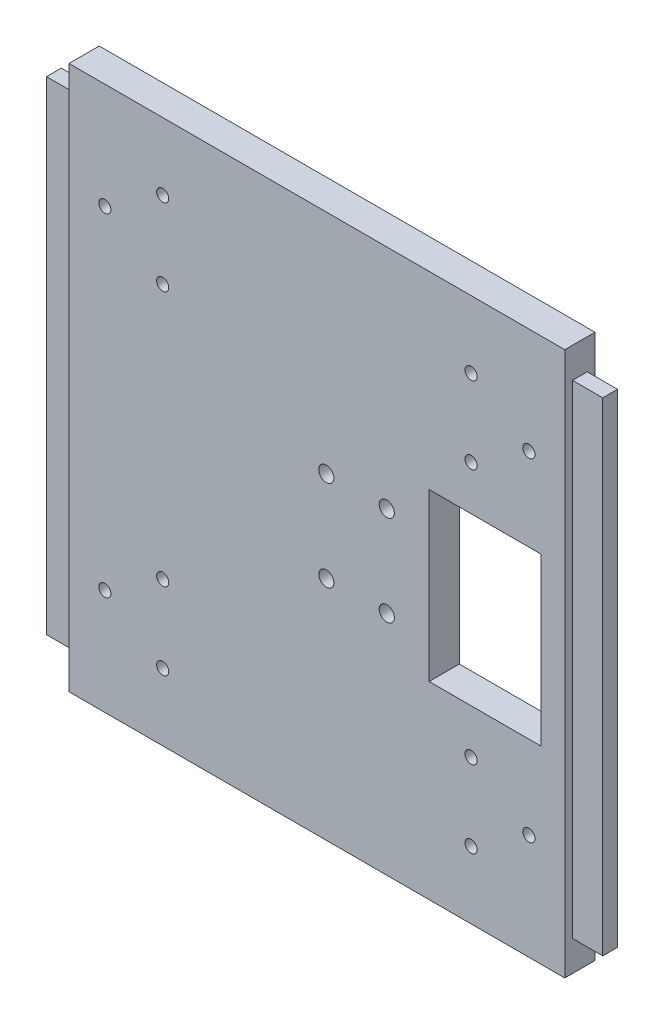
ISO-10303-21;
HEADER;
FILE_DESCRIPTION(('STEP AP214'),'2;1');
FILE_NAME('part.step','',(''),(''),'','','');
FILE_SCHEMA(('AUTOMOTIVE_DESIGN { 1 0 10303 214 1 1 1 1 }'));
ENDSEC;
DATA;
#1=APPLICATION_CONTEXT('core data for automotive mechanical design processes');
#2=APPLICATION_PROTOCOL_DEFINITION('international standard','automotive_design',2000,#1);
#3=PRODUCT_CONTEXT('',#1,'mechanical');
#4=PRODUCT('Part','Part','',(#3));
#5=PRODUCT_RELATED_PRODUCT_CATEGORY('part','',(#4));
#6=PRODUCT_DEFINITION_FORMATION('','',#4);
#7=PRODUCT_DEFINITION_CONTEXT('part definition',#1,'design');
#8=PRODUCT_DEFINITION('design','',#6,#7);
#9=PRODUCT_DEFINITION_SHAPE('','',#8);
#10=(LENGTH_UNIT() NAMED_UNIT(*) SI_UNIT(.MILLI.,.METRE.));
#11=(NAMED_UNIT(*) PLANE_ANGLE_UNIT() SI_UNIT($,.RADIAN.));
#12=(NAMED_UNIT(*) SI_UNIT($,.STERADIAN.) SOLID_ANGLE_UNIT());
#13=UNCERTAINTY_MEASURE_WITH_UNIT(LENGTH_MEASURE(1.E-05),#10,'distance_accuracy_value','');
#14=(GEOMETRIC_REPRESENTATION_CONTEXT(3) GLOBAL_UNCERTAINTY_ASSIGNED_CONTEXT((#13)) GLOBAL_UNIT_ASSIGNED_CONTEXT((#10,
#11,#12)) REPRESENTATION_CONTEXT('',''));
#15=CARTESIAN_POINT('',(0.,0.,0.));
#16=DIRECTION('',(0.,0.,1.));
#17=DIRECTION('',(1.,0.,0.));
#18=AXIS2_PLACEMENT_3D('',#15,#16,#17);
#19=CARTESIAN_POINT('',(0.,0.,10.));
#20=DIRECTION('',(1.,0.,0.));
#21=DIRECTION('',(0.,0.,-1.));
#22=AXIS2_PLACEMENT_3D('',#19,#20,#21);
#23=PLANE('',#22);
#24=DIRECTION('',(0.,-1.,0.));
#25=VECTOR('',#24,1.);
#26=CARTESIAN_POINT('',(0.,0.,0.));
#27=LINE('',#26,#25);
#28=CARTESIAN_POINT('',(0.,180.,0.));
#29=VERTEX_POINT('',#28);
#30=CARTESIAN_POINT('',(0.,0.,0.));
#31=VERTEX_POINT('',#30);
#32=EDGE_CURVE('E189',#29,#31,#27,.T.);
#33=ORIENTED_EDGE('',*,*,#32,.T.);
#34=DIRECTION('',(0.,0.,-1.));
#35=VECTOR('',#34,1.);
#36=CARTESIAN_POINT('',(0.,0.,10.));
#37=LINE('',#36,#35);
#38=CARTESIAN_POINT('',(0.,0.,10.));
#39=VERTEX_POINT('',#38);
#40=EDGE_CURVE('E162',#39,#31,#37,.T.);
#41=ORIENTED_EDGE('',*,*,#40,.F.);
#42=DIRECTION('',(0.,-1.,0.));
#43=VECTOR('',#42,1.);
#44=CARTESIAN_POINT('',(0.,0.,10.));
#45=LINE('',#44,#43);
#46=CARTESIAN_POINT('',(0.,180.,10.));
#47=VERTEX_POINT('',#46);
#48=EDGE_CURVE('E184',#47,#39,#45,.T.);
#49=ORIENTED_EDGE('',*,*,#48,.F.);
#50=DIRECTION('',(0.,0.,-1.));
#51=VECTOR('',#50,1.);
#52=CARTESIAN_POINT('',(0.,180.,10.));
#53=LINE('',#52,#51);
#54=EDGE_CURVE('E178',#47,#29,#53,.T.);
#55=ORIENTED_EDGE('',*,*,#54,.T.);
#56=EDGE_LOOP('',(#33,#41,#49,#55));
#57=FACE_BOUND('',#56,.T.);
#58=DIRECTION('',(0.,-1.,0.));
#59=VECTOR('',#58,1.);
#60=CARTESIAN_POINT('',(0.,169.94,2.55999999999999));
#61=LINE('',#60,#59);
#62=CARTESIAN_POINT('',(0.,169.94,2.55999999999999));
#63=VERTEX_POINT('',#62);
#64=CARTESIAN_POINT('',(0.,10.06,2.56000000000001));
#65=VERTEX_POINT('',#64);
#66=EDGE_CURVE('E222',#63,#65,#61,.T.);
#67=ORIENTED_EDGE('',*,*,#66,.F.);
#68=DIRECTION('',(0.,0.,-1.));
#69=VECTOR('',#68,1.);
#70=CARTESIAN_POINT('',(0.,169.94,2.55999999999999));
#71=LINE('',#70,#69);
#72=CARTESIAN_POINT('',(0.,169.94,7.43999999999999));
#73=VERTEX_POINT('',#72);
#74=EDGE_CURVE('E212',#73,#63,#71,.T.);
#75=ORIENTED_EDGE('',*,*,#74,.F.);
#76=DIRECTION('',(0.,1.,0.));
#77=VECTOR('',#76,1.);
#78=CARTESIAN_POINT('',(0.,169.94,7.43999999999999));
#79=LINE('',#78,#77);
#80=CARTESIAN_POINT('',(0.,10.06,7.44000000000001));
#81=VERTEX_POINT('',#80);
#82=EDGE_CURVE('E216',#81,#73,#79,.T.);
#83=ORIENTED_EDGE('',*,*,#82,.F.);
#84=DIRECTION('',(0.,0.,1.));
#85=VECTOR('',#84,1.);
#86=CARTESIAN_POINT('',(0.,10.06,2.56000000000001));
#87=LINE('',#86,#85);
#88=EDGE_CURVE('E219',#65,#81,#87,.T.);
#89=ORIENTED_EDGE('',*,*,#88,.F.);
#90=EDGE_LOOP('',(#67,#75,#83,#89));
#91=FACE_BOUND('',#90,.T.);
#92=ADVANCED_FACE('F37',(#57,#91),#23,.F.);
#93=CARTESIAN_POINT('',(0.,0.,10.));
#94=DIRECTION('',(0.,1.,0.));
#95=DIRECTION('',(0.,0.,1.));
#96=AXIS2_PLACEMENT_3D('',#93,#94,#95);
#97=PLANE('',#96);
#98=DIRECTION('',(1.,0.,0.));
#99=VECTOR('',#98,1.);
#100=CARTESIAN_POINT('',(0.,0.,0.));
#101=LINE('',#100,#99);
#102=CARTESIAN_POINT('',(164.,0.,0.));
#103=VERTEX_POINT('',#102);
#104=EDGE_CURVE('E187',#31,#103,#101,.T.);
#105=ORIENTED_EDGE('',*,*,#104,.T.);
#106=DIRECTION('',(0.,0.,-1.));
#107=VECTOR('',#106,1.);
#108=CARTESIAN_POINT('',(164.,0.,10.));
#109=LINE('',#108,#107);
#110=CARTESIAN_POINT('',(164.,0.,10.));
#111=VERTEX_POINT('',#110);
#112=EDGE_CURVE('E172',#111,#103,#109,.T.);
#113=ORIENTED_EDGE('',*,*,#112,.F.);
#114=DIRECTION('',(1.,0.,0.));
#115=VECTOR('',#114,1.);
#116=CARTESIAN_POINT('',(0.,0.,10.));
#117=LINE('',#116,#115);
#118=EDGE_CURVE('E196',#39,#111,#117,.T.);
#119=ORIENTED_EDGE('',*,*,#118,.F.);
#120=ORIENTED_EDGE('',*,*,#40,.T.);
#121=EDGE_LOOP('',(#105,#113,#119,#120));
#122=FACE_BOUND('',#121,.T.);
#123=ADVANCED_FACE('F425',(#122),#97,.F.);
#124=CARTESIAN_POINT('',(164.,0.,10.));
#125=DIRECTION('',(-1.,0.,0.));
#126=DIRECTION('',(0.,0.,1.));
#127=AXIS2_PLACEMENT_3D('',#124,#125,#126);
#128=PLANE('',#127);
#129=DIRECTION('',(0.,0.,-1.));
#130=VECTOR('',#129,1.);
#131=CARTESIAN_POINT('',(164.,169.94,2.55999999999999));
#132=LINE('',#131,#130);
#133=CARTESIAN_POINT('',(164.,169.94,7.43999999999999));
#134=VERTEX_POINT('',#133);
#135=CARTESIAN_POINT('',(164.,169.94,2.55999999999999));
#136=VERTEX_POINT('',#135);
#137=EDGE_CURVE('E249',#134,#136,#132,.T.);
#138=ORIENTED_EDGE('',*,*,#137,.T.);
#139=DIRECTION('',(0.,-1.,0.));
#140=VECTOR('',#139,1.);
#141=CARTESIAN_POINT('',(164.,169.94,2.55999999999999));
#142=LINE('',#141,#140);
#143=CARTESIAN_POINT('',(164.,10.06,2.56000000000001));
#144=VERTEX_POINT('',#143);
#145=EDGE_CURVE('E252',#136,#144,#142,.T.);
#146=ORIENTED_EDGE('',*,*,#145,.T.);
#147=DIRECTION('',(0.,0.,1.));
#148=VECTOR('',#147,1.);
#149=CARTESIAN_POINT('',(164.,10.06,2.56000000000001));
#150=LINE('',#149,#148);
#151=CARTESIAN_POINT('',(164.,10.06,7.44000000000001));
#152=VERTEX_POINT('',#151);
#153=EDGE_CURVE('E242',#144,#152,#150,.T.);
#154=ORIENTED_EDGE('',*,*,#153,.T.);
#155=DIRECTION('',(0.,1.,0.));
#156=VECTOR('',#155,1.);
#157=CARTESIAN_POINT('',(164.,169.94,7.43999999999999));
#158=LINE('',#157,#156);
#159=EDGE_CURVE('E246',#152,#134,#158,.T.);
#160=ORIENTED_EDGE('',*,*,#159,.T.);
#161=EDGE_LOOP('',(#138,#146,#154,#160));
#162=FACE_BOUND('',#161,.T.);
#163=DIRECTION('',(0.,1.,0.));
#164=VECTOR('',#163,1.);
#165=CARTESIAN_POINT('',(164.,0.,0.));
#166=LINE('',#165,#164);
#167=CARTESIAN_POINT('',(164.,180.,0.));
#168=VERTEX_POINT('',#167);
#169=EDGE_CURVE('E185',#103,#168,#166,.T.);
#170=ORIENTED_EDGE('',*,*,#169,.T.);
#171=DIRECTION('',(0.,0.,-1.));
#172=VECTOR('',#171,1.);
#173=CARTESIAN_POINT('',(164.,180.,10.));
#174=LINE('',#173,#172);
#175=CARTESIAN_POINT('',(164.,180.,10.));
#176=VERTEX_POINT('',#175);
#177=EDGE_CURVE('E175',#176,#168,#174,.T.);
#178=ORIENTED_EDGE('',*,*,#177,.F.);
#179=DIRECTION('',(0.,1.,0.));
#180=VECTOR('',#179,1.);
#181=CARTESIAN_POINT('',(164.,0.,10.));
#182=LINE('',#181,#180);
#183=EDGE_CURVE('E194',#111,#176,#182,.T.);
#184=ORIENTED_EDGE('',*,*,#183,.F.);
#185=ORIENTED_EDGE('',*,*,#112,.T.);
#186=EDGE_LOOP('',(#170,#178,#184,#185));
#187=FACE_BOUND('',#186,.T.);
#188=ADVANCED_FACE('F430',(#162,#187),#128,.F.);
#189=CARTESIAN_POINT('',(0.,180.,10.));
#190=DIRECTION('',(0.,-1.,0.));
#191=DIRECTION('',(0.,0.,-1.));
#192=AXIS2_PLACEMENT_3D('',#189,#190,#191);
#193=PLANE('',#192);
#194=DIRECTION('',(-1.,0.,0.));
#195=VECTOR('',#194,1.);
#196=CARTESIAN_POINT('',(0.,180.,0.));
#197=LINE('',#196,#195);
#198=EDGE_CURVE('E182',#168,#29,#197,.T.);
#199=ORIENTED_EDGE('',*,*,#198,.T.);
#200=ORIENTED_EDGE('',*,*,#54,.F.);
#201=DIRECTION('',(-1.,0.,0.));
#202=VECTOR('',#201,1.);
#203=CARTESIAN_POINT('',(0.,180.,10.));
#204=LINE('',#203,#202);
#205=EDGE_CURVE('E181',#176,#47,#204,.T.);
#206=ORIENTED_EDGE('',*,*,#205,.F.);
#207=ORIENTED_EDGE('',*,*,#177,.T.);
#208=EDGE_LOOP('',(#199,#200,#206,#207));
#209=FACE_BOUND('',#208,.T.);
#210=ADVANCED_FACE('F385',(#209),#193,.F.);
#211=CARTESIAN_POINT('',(0.,0.,10.));
#212=DIRECTION('',(0.,0.,-1.));
#213=DIRECTION('',(-1.,0.,0.));
#214=AXIS2_PLACEMENT_3D('',#211,#212,#213);
#215=PLANE('',#214);
#216=CARTESIAN_POINT('',(85.1178631754565,75.,10.));
#217=DIRECTION('',(0.,0.,1.));
#218=DIRECTION('',(1.,0.,0.));
#219=AXIS2_PLACEMENT_3D('',#216,#217,#218);
#220=CIRCLE('',#219,2.5);
#221=CARTESIAN_POINT('',(87.6178631754566,75.,10.));
#222=VERTEX_POINT('',#221);
#223=EDGE_CURVE('E153',#222,#222,#220,.T.);
#224=ORIENTED_EDGE('',*,*,#223,.F.);
#225=EDGE_LOOP('',(#224));
#226=FACE_BOUND('',#225,.T.);
#227=DIRECTION('',(1.,0.,0.));
#228=VECTOR('',#227,1.);
#229=CARTESIAN_POINT('',(119.117863175457,62.5,10.));
#230=LINE('',#229,#228);
#231=CARTESIAN_POINT('',(119.117863175457,62.5,10.));
#232=VERTEX_POINT('',#231);
#233=CARTESIAN_POINT('',(156.117863175457,62.5,10.));
#234=VERTEX_POINT('',#233);
#235=EDGE_CURVE('E352',#232,#234,#230,.T.);
#236=ORIENTED_EDGE('',*,*,#235,.F.);
#237=DIRECTION('',(0.,-1.,0.));
#238=VECTOR('',#237,1.);
#239=CARTESIAN_POINT('',(119.117863175457,117.5,10.));
#240=LINE('',#239,#238);
#241=CARTESIAN_POINT('',(119.117863175457,117.5,10.));
#242=VERTEX_POINT('',#241);
#243=EDGE_CURVE('E56',#242,#232,#240,.T.);
#244=ORIENTED_EDGE('',*,*,#243,.F.);
#245=DIRECTION('',(-1.,0.,0.));
#246=VECTOR('',#245,1.);
#247=CARTESIAN_POINT('',(119.117863175457,117.5,10.));
#248=LINE('',#247,#246);
#249=CARTESIAN_POINT('',(156.117863175457,117.5,10.));
#250=VERTEX_POINT('',#249);
#251=EDGE_CURVE('E152',#250,#242,#248,.T.);
#252=ORIENTED_EDGE('',*,*,#251,.F.);
#253=DIRECTION('',(0.,1.,0.));
#254=VECTOR('',#253,1.);
#255=CARTESIAN_POINT('',(156.117863175457,117.5,10.));
#256=LINE('',#255,#254);
#257=EDGE_CURVE('E349',#234,#250,#256,.T.);
#258=ORIENTED_EDGE('',*,*,#257,.F.);
#259=EDGE_LOOP('',(#236,#244,#252,#258));
#260=FACE_BOUND('',#259,.T.);
#261=CARTESIAN_POINT('',(105.117863175457,105.,10.));
#262=DIRECTION('',(0.,0.,1.));
#263=DIRECTION('',(1.,0.,0.));
#264=AXIS2_PLACEMENT_3D('',#261,#262,#263);
#265=CIRCLE('',#264,2.50000000000001);
#266=CARTESIAN_POINT('',(107.617863175457,105.,10.));
#267=VERTEX_POINT('',#266);
#268=EDGE_CURVE('E367',#267,#267,#265,.T.);
#269=ORIENTED_EDGE('',*,*,#268,.F.);
#270=EDGE_LOOP('',(#269));
#271=FACE_BOUND('',#270,.T.);
#272=CARTESIAN_POINT('',(105.117863175457,75.,10.));
#273=DIRECTION('',(0.,0.,1.));
#274=DIRECTION('',(1.,0.,0.));
#275=AXIS2_PLACEMENT_3D('',#272,#273,#274);
#276=CIRCLE('',#275,2.50000000000001);
#277=CARTESIAN_POINT('',(107.617863175457,75.,10.));
#278=VERTEX_POINT('',#277);
#279=EDGE_CURVE('E361',#278,#278,#276,.T.);
#280=ORIENTED_EDGE('',*,*,#279,.F.);
#281=EDGE_LOOP('',(#280));
#282=FACE_BOUND('',#281,.T.);
#283=CARTESIAN_POINT('',(85.1178631754565,105.,10.));
#284=DIRECTION('',(0.,0.,1.));
#285=DIRECTION('',(1.,0.,0.));
#286=AXIS2_PLACEMENT_3D('',#283,#284,#285);
#287=CIRCLE('',#286,2.5);
#288=CARTESIAN_POINT('',(87.6178631754566,105.,10.));
#289=VERTEX_POINT('',#288);
#290=EDGE_CURVE('E338',#289,#289,#287,.T.);
#291=ORIENTED_EDGE('',*,*,#290,.F.);
#292=EDGE_LOOP('',(#291));
#293=FACE_BOUND('',#292,.T.);
#294=CARTESIAN_POINT('',(152.142557300424,35.,10.));
#295=DIRECTION('',(0.,0.,-1.));
#296=DIRECTION('',(1.,0.,0.));
#297=AXIS2_PLACEMENT_3D('',#294,#295,#296);
#298=CIRCLE('',#297,2.);
#299=CARTESIAN_POINT('',(154.142557300424,35.,10.));
#300=VERTEX_POINT('',#299);
#301=EDGE_CURVE('E299',#300,#300,#298,.T.);
#302=ORIENTED_EDGE('',*,*,#301,.T.);
#303=EDGE_LOOP('',(#302));
#304=FACE_BOUND('',#303,.T.);
#305=CARTESIAN_POINT('',(133.,22.25,10.));
#306=DIRECTION('',(0.,0.,-1.));
#307=DIRECTION('',(1.,0.,0.));
#308=AXIS2_PLACEMENT_3D('',#305,#306,#307);
#309=CIRCLE('',#308,2.);
#310=CARTESIAN_POINT('',(135.,22.25,10.));
#311=VERTEX_POINT('',#310);
#312=EDGE_CURVE('E306',#311,#311,#309,.T.);
#313=ORIENTED_EDGE('',*,*,#312,.T.);
#314=EDGE_LOOP('',(#313));
#315=FACE_BOUND('',#314,.T.);
#316=CARTESIAN_POINT('',(133.,47.75,10.));
#317=DIRECTION('',(0.,0.,-1.));
#318=DIRECTION('',(1.,0.,0.));
#319=AXIS2_PLACEMENT_3D('',#316,#317,#318);
#320=CIRCLE('',#319,2.);
#321=CARTESIAN_POINT('',(135.,47.75,10.));
#322=VERTEX_POINT('',#321);
#323=EDGE_CURVE('E312',#322,#322,#320,.T.);
#324=ORIENTED_EDGE('',*,*,#323,.T.);
#325=EDGE_LOOP('',(#324));
#326=FACE_BOUND('',#325,.T.);
#327=CARTESIAN_POINT('',(31.,132.25,10.));
#328=DIRECTION('',(0.,0.,-1.));
#329=DIRECTION('',(-1.,0.,0.));
#330=AXIS2_PLACEMENT_3D('',#327,#328,#329);
#331=CIRCLE('',#330,2.);
#332=CARTESIAN_POINT('',(29.,132.25,10.));
#333=VERTEX_POINT('',#332);
#334=EDGE_CURVE('E276',#333,#333,#331,.T.);
#335=ORIENTED_EDGE('',*,*,#334,.T.);
#336=EDGE_LOOP('',(#335));
#337=FACE_BOUND('',#336,.T.);
#338=CARTESIAN_POINT('',(31.,157.75,10.));
#339=DIRECTION('',(0.,0.,-1.));
#340=DIRECTION('',(-1.,0.,0.));
#341=AXIS2_PLACEMENT_3D('',#338,#339,#340);
#342=CIRCLE('',#341,2.);
#343=CARTESIAN_POINT('',(29.,157.75,10.));
#344=VERTEX_POINT('',#343);
#345=EDGE_CURVE('E275',#344,#344,#342,.T.);
#346=ORIENTED_EDGE('',*,*,#345,.T.);
#347=EDGE_LOOP('',(#346));
#348=FACE_BOUND('',#347,.T.);
#349=CARTESIAN_POINT('',(11.8574426995764,145.,10.));
#350=DIRECTION('',(0.,0.,-1.));
#351=DIRECTION('',(-1.,0.,0.));
#352=AXIS2_PLACEMENT_3D('',#349,#350,#351);
#353=CIRCLE('',#352,2.);
#354=CARTESIAN_POINT('',(9.85744269957642,145.,10.));
#355=VERTEX_POINT('',#354);
#356=EDGE_CURVE('E282',#355,#355,#353,.T.);
#357=ORIENTED_EDGE('',*,*,#356,.T.);
#358=EDGE_LOOP('',(#357));
#359=FACE_BOUND('',#358,.T.);
#360=CARTESIAN_POINT('',(133.,132.25,10.));
#361=DIRECTION('',(0.,0.,-1.));
#362=DIRECTION('',(-1.,0.,0.));
#363=AXIS2_PLACEMENT_3D('',#360,#361,#362);
#364=CIRCLE('',#363,2.);
#365=CARTESIAN_POINT('',(131.,132.25,10.));
#366=VERTEX_POINT('',#365);
#367=EDGE_CURVE('E288',#366,#366,#364,.T.);
#368=ORIENTED_EDGE('',*,*,#367,.T.);
#369=EDGE_LOOP('',(#368));
#370=FACE_BOUND('',#369,.T.);
#371=CARTESIAN_POINT('',(133.,157.75,10.));
#372=DIRECTION('',(0.,0.,-1.));
#373=DIRECTION('',(-1.,0.,0.));
#374=AXIS2_PLACEMENT_3D('',#371,#372,#373);
#375=CIRCLE('',#374,2.);
#376=CARTESIAN_POINT('',(131.,157.75,10.));
#377=VERTEX_POINT('',#376);
#378=EDGE_CURVE('E269',#377,#377,#375,.T.);
#379=ORIENTED_EDGE('',*,*,#378,.T.);
#380=EDGE_LOOP('',(#379));
#381=FACE_BOUND('',#380,.T.);
#382=CARTESIAN_POINT('',(31.,47.75,10.));
#383=DIRECTION('',(0.,0.,-1.));
#384=DIRECTION('',(1.,0.,0.));
#385=AXIS2_PLACEMENT_3D('',#382,#383,#384);
#386=CIRCLE('',#385,2.);
#387=CARTESIAN_POINT('',(33.,47.75,10.));
#388=VERTEX_POINT('',#387);
#389=EDGE_CURVE('E300',#388,#388,#386,.T.);
#390=ORIENTED_EDGE('',*,*,#389,.T.);
#391=EDGE_LOOP('',(#390));
#392=FACE_BOUND('',#391,.T.);
#393=CARTESIAN_POINT('',(31.,22.25,10.));
#394=DIRECTION('',(0.,0.,-1.));
#395=DIRECTION('',(1.,0.,0.));
#396=AXIS2_PLACEMENT_3D('',#393,#394,#395);
#397=CIRCLE('',#396,2.);
#398=CARTESIAN_POINT('',(33.,22.25,10.));
#399=VERTEX_POINT('',#398);
#400=EDGE_CURVE('E330',#399,#399,#397,.T.);
#401=ORIENTED_EDGE('',*,*,#400,.T.);
#402=EDGE_LOOP('',(#401));
#403=FACE_BOUND('',#402,.T.);
#404=CARTESIAN_POINT('',(11.8574426995764,35.,10.));
#405=DIRECTION('',(0.,0.,-1.));
#406=DIRECTION('',(1.,0.,0.));
#407=AXIS2_PLACEMENT_3D('',#404,#405,#406);
#408=CIRCLE('',#407,2.);
#409=CARTESIAN_POINT('',(13.8574426995764,35.,10.));
#410=VERTEX_POINT('',#409);
#411=EDGE_CURVE('E323',#410,#410,#408,.T.);
#412=ORIENTED_EDGE('',*,*,#411,.T.);
#413=EDGE_LOOP('',(#412));
#414=FACE_BOUND('',#413,.T.);
#415=CARTESIAN_POINT('',(152.142557300424,145.,10.));
#416=DIRECTION('',(0.,0.,-1.));
#417=DIRECTION('',(-1.,0.,0.));
#418=AXIS2_PLACEMENT_3D('',#415,#416,#417);
#419=CIRCLE('',#418,2.);
#420=CARTESIAN_POINT('',(150.142557300424,145.,10.));
#421=VERTEX_POINT('',#420);
#422=EDGE_CURVE('E255',#421,#421,#419,.T.);
#423=ORIENTED_EDGE('',*,*,#422,.T.);
#424=EDGE_LOOP('',(#423));
#425=FACE_BOUND('',#424,.T.);
#426=ORIENTED_EDGE('',*,*,#48,.T.);
#427=ORIENTED_EDGE('',*,*,#118,.T.);
#428=ORIENTED_EDGE('',*,*,#183,.T.);
#429=ORIENTED_EDGE('',*,*,#205,.T.);
#430=EDGE_LOOP('',(#426,#427,#428,#429));
#431=FACE_BOUND('',#430,.T.);
#432=ADVANCED_FACE('F382',(#226,#260,#271,#282,#293,#304,#315,#326,#337,#348,#359,#370,#381,
#392,#403,#414,#425,#431),#215,.F.);
#433=CARTESIAN_POINT('',(0.,0.,0.));
#434=DIRECTION('',(0.,0.,-1.));
#435=DIRECTION('',(-1.,0.,0.));
#436=AXIS2_PLACEMENT_3D('',#433,#434,#435);
#437=PLANE('',#436);
#438=DIRECTION('',(1.,0.,0.));
#439=VECTOR('',#438,1.);
#440=CARTESIAN_POINT('',(0.,117.5,0.));
#441=LINE('',#440,#439);
#442=CARTESIAN_POINT('',(119.117863175457,117.5,0.));
#443=VERTEX_POINT('',#442);
#444=CARTESIAN_POINT('',(156.117863175457,117.5,0.));
#445=VERTEX_POINT('',#444);
#446=EDGE_CURVE('E11',#443,#445,#441,.T.);
#447=ORIENTED_EDGE('',*,*,#446,.F.);
#448=DIRECTION('',(0.,1.,0.));
#449=VECTOR('',#448,1.);
#450=CARTESIAN_POINT('',(119.117863175457,0.,0.));
#451=LINE('',#450,#449);
#452=CARTESIAN_POINT('',(119.117863175457,62.5,0.));
#453=VERTEX_POINT('',#452);
#454=EDGE_CURVE('E157',#453,#443,#451,.T.);
#455=ORIENTED_EDGE('',*,*,#454,.F.);
#456=DIRECTION('',(-1.,0.,0.));
#457=VECTOR('',#456,1.);
#458=CARTESIAN_POINT('',(0.,62.5,0.));
#459=LINE('',#458,#457);
#460=CARTESIAN_POINT('',(156.117863175457,62.5,0.));
#461=VERTEX_POINT('',#460);
#462=EDGE_CURVE('E161',#461,#453,#459,.T.);
#463=ORIENTED_EDGE('',*,*,#462,.F.);
#464=DIRECTION('',(0.,-1.,0.));
#465=VECTOR('',#464,1.);
#466=CARTESIAN_POINT('',(156.117863175457,0.,0.));
#467=LINE('',#466,#465);
#468=EDGE_CURVE('E44',#445,#461,#467,.T.);
#469=ORIENTED_EDGE('',*,*,#468,.F.);
#470=EDGE_LOOP('',(#447,#455,#463,#469));
#471=FACE_BOUND('',#470,.T.);
#472=CARTESIAN_POINT('',(152.142557300424,35.,0.));
#473=DIRECTION('',(0.,0.,-1.));
#474=DIRECTION('',(1.,0.,0.));
#475=AXIS2_PLACEMENT_3D('',#472,#473,#474);
#476=CIRCLE('',#475,2.);
#477=CARTESIAN_POINT('',(154.142557300424,35.,0.));
#478=VERTEX_POINT('',#477);
#479=EDGE_CURVE('E296',#478,#478,#476,.T.);
#480=ORIENTED_EDGE('',*,*,#479,.F.);
#481=EDGE_LOOP('',(#480));
#482=FACE_BOUND('',#481,.T.);
#483=CARTESIAN_POINT('',(133.,22.25,0.));
#484=DIRECTION('',(0.,0.,-1.));
#485=DIRECTION('',(1.,0.,0.));
#486=AXIS2_PLACEMENT_3D('',#483,#484,#485);
#487=CIRCLE('',#486,2.);
#488=CARTESIAN_POINT('',(135.,22.25,0.));
#489=VERTEX_POINT('',#488);
#490=EDGE_CURVE('E303',#489,#489,#487,.T.);
#491=ORIENTED_EDGE('',*,*,#490,.F.);
#492=EDGE_LOOP('',(#491));
#493=FACE_BOUND('',#492,.T.);
#494=CARTESIAN_POINT('',(133.,47.75,0.));
#495=DIRECTION('',(0.,0.,-1.));
#496=DIRECTION('',(1.,0.,0.));
#497=AXIS2_PLACEMENT_3D('',#494,#495,#496);
#498=CIRCLE('',#497,2.);
#499=CARTESIAN_POINT('',(135.,47.75,0.));
#500=VERTEX_POINT('',#499);
#501=EDGE_CURVE('E309',#500,#500,#498,.T.);
#502=ORIENTED_EDGE('',*,*,#501,.F.);
#503=EDGE_LOOP('',(#502));
#504=FACE_BOUND('',#503,.T.);
#505=CARTESIAN_POINT('',(31.,132.25,0.));
#506=DIRECTION('',(0.,0.,-1.));
#507=DIRECTION('',(-1.,0.,0.));
#508=AXIS2_PLACEMENT_3D('',#505,#506,#507);
#509=CIRCLE('',#508,2.);
#510=CARTESIAN_POINT('',(29.,132.25,0.));
#511=VERTEX_POINT('',#510);
#512=EDGE_CURVE('E315',#511,#511,#509,.T.);
#513=ORIENTED_EDGE('',*,*,#512,.F.);
#514=EDGE_LOOP('',(#513));
#515=FACE_BOUND('',#514,.T.);
#516=CARTESIAN_POINT('',(31.,157.75,0.));
#517=DIRECTION('',(0.,0.,-1.));
#518=DIRECTION('',(-1.,0.,0.));
#519=AXIS2_PLACEMENT_3D('',#516,#517,#518);
#520=CIRCLE('',#519,2.);
#521=CARTESIAN_POINT('',(29.,157.75,0.));
#522=VERTEX_POINT('',#521);
#523=EDGE_CURVE('E272',#522,#522,#520,.T.);
#524=ORIENTED_EDGE('',*,*,#523,.F.);
#525=EDGE_LOOP('',(#524));
#526=FACE_BOUND('',#525,.T.);
#527=CARTESIAN_POINT('',(11.8574426995764,145.,0.));
#528=DIRECTION('',(0.,0.,-1.));
#529=DIRECTION('',(-1.,0.,0.));
#530=AXIS2_PLACEMENT_3D('',#527,#528,#529);
#531=CIRCLE('',#530,2.);
#532=CARTESIAN_POINT('',(9.85744269957642,145.,0.));
#533=VERTEX_POINT('',#532);
#534=EDGE_CURVE('E279',#533,#533,#531,.T.);
#535=ORIENTED_EDGE('',*,*,#534,.F.);
#536=EDGE_LOOP('',(#535));
#537=FACE_BOUND('',#536,.T.);
#538=CARTESIAN_POINT('',(133.,132.25,0.));
#539=DIRECTION('',(0.,0.,-1.));
#540=DIRECTION('',(-1.,0.,0.));
#541=AXIS2_PLACEMENT_3D('',#538,#539,#540);
#542=CIRCLE('',#541,2.);
#543=CARTESIAN_POINT('',(131.,132.25,0.));
#544=VERTEX_POINT('',#543);
#545=EDGE_CURVE('E285',#544,#544,#542,.T.);
#546=ORIENTED_EDGE('',*,*,#545,.F.);
#547=EDGE_LOOP('',(#546));
#548=FACE_BOUND('',#547,.T.);
#549=CARTESIAN_POINT('',(133.,157.75,0.));
#550=DIRECTION('',(0.,0.,-1.));
#551=DIRECTION('',(-1.,0.,0.));
#552=AXIS2_PLACEMENT_3D('',#549,#550,#551);
#553=CIRCLE('',#552,2.);
#554=CARTESIAN_POINT('',(131.,157.75,0.));
#555=VERTEX_POINT('',#554);
#556=EDGE_CURVE('E291',#555,#555,#553,.T.);
#557=ORIENTED_EDGE('',*,*,#556,.F.);
#558=EDGE_LOOP('',(#557));
#559=FACE_BOUND('',#558,.T.);
#560=CARTESIAN_POINT('',(31.,47.75,0.));
#561=DIRECTION('',(0.,0.,-1.));
#562=DIRECTION('',(1.,0.,0.));
#563=AXIS2_PLACEMENT_3D('',#560,#561,#562);
#564=CIRCLE('',#563,2.);
#565=CARTESIAN_POINT('',(33.,47.75,0.));
#566=VERTEX_POINT('',#565);
#567=EDGE_CURVE('E333',#566,#566,#564,.T.);
#568=ORIENTED_EDGE('',*,*,#567,.F.);
#569=EDGE_LOOP('',(#568));
#570=FACE_BOUND('',#569,.T.);
#571=CARTESIAN_POINT('',(31.,22.25,0.));
#572=DIRECTION('',(0.,0.,-1.));
#573=DIRECTION('',(1.,0.,0.));
#574=AXIS2_PLACEMENT_3D('',#571,#572,#573);
#575=CIRCLE('',#574,2.);
#576=CARTESIAN_POINT('',(33.,22.25,0.));
#577=VERTEX_POINT('',#576);
#578=EDGE_CURVE('E327',#577,#577,#575,.T.);
#579=ORIENTED_EDGE('',*,*,#578,.F.);
#580=EDGE_LOOP('',(#579));
#581=FACE_BOUND('',#580,.T.);
#582=CARTESIAN_POINT('',(11.8574426995764,35.,0.));
#583=DIRECTION('',(0.,0.,-1.));
#584=DIRECTION('',(1.,0.,0.));
#585=AXIS2_PLACEMENT_3D('',#582,#583,#584);
#586=CIRCLE('',#585,2.);
#587=CARTESIAN_POINT('',(13.8574426995764,35.,0.));
#588=VERTEX_POINT('',#587);
#589=EDGE_CURVE('E320',#588,#588,#586,.T.);
#590=ORIENTED_EDGE('',*,*,#589,.F.);
#591=EDGE_LOOP('',(#590));
#592=FACE_BOUND('',#591,.T.);
#593=CARTESIAN_POINT('',(152.142557300424,145.,0.));
#594=DIRECTION('',(0.,0.,-1.));
#595=DIRECTION('',(-1.,0.,0.));
#596=AXIS2_PLACEMENT_3D('',#593,#594,#595);
#597=CIRCLE('',#596,2.);
#598=CARTESIAN_POINT('',(150.142557300424,145.,0.));
#599=VERTEX_POINT('',#598);
#600=EDGE_CURVE('E266',#599,#599,#597,.T.);
#601=ORIENTED_EDGE('',*,*,#600,.F.);
#602=EDGE_LOOP('',(#601));
#603=FACE_BOUND('',#602,.T.);
#604=ORIENTED_EDGE('',*,*,#32,.F.);
#605=ORIENTED_EDGE('',*,*,#198,.F.);
#606=ORIENTED_EDGE('',*,*,#169,.F.);
#607=ORIENTED_EDGE('',*,*,#104,.F.);
#608=EDGE_LOOP('',(#604,#605,#606,#607));
#609=FACE_BOUND('',#608,.T.);
#610=ADVANCED_FACE('F164',(#471,#482,#493,#504,#515,#526,#537,#548,#559,#570,#581,#592,#603,
#609),#437,.T.);
#611=CARTESIAN_POINT('',(-10.,169.94,2.55999999999999));
#612=DIRECTION('',(0.,0.,1.));
#613=DIRECTION('',(0.,-1.,0.));
#614=AXIS2_PLACEMENT_3D('',#611,#612,#613);
#615=PLANE('',#614);
#616=ORIENTED_EDGE('',*,*,#66,.T.);
#617=DIRECTION('',(1.,0.,0.));
#618=VECTOR('',#617,1.);
#619=CARTESIAN_POINT('',(-10.,10.06,2.56000000000001));
#620=LINE('',#619,#618);
#621=CARTESIAN_POINT('',(-10.,10.06,2.56000000000001));
#622=VERTEX_POINT('',#621);
#623=EDGE_CURVE('E192',#622,#65,#620,.T.);
#624=ORIENTED_EDGE('',*,*,#623,.F.);
#625=DIRECTION('',(0.,-1.,0.));
#626=VECTOR('',#625,1.);
#627=CARTESIAN_POINT('',(-10.,169.94,2.55999999999999));
#628=LINE('',#627,#626);
#629=CARTESIAN_POINT('',(-10.,169.94,2.55999999999999));
#630=VERTEX_POINT('',#629);
#631=EDGE_CURVE('E215',#630,#622,#628,.T.);
#632=ORIENTED_EDGE('',*,*,#631,.F.);
#633=DIRECTION('',(1.,0.,0.));
#634=VECTOR('',#633,1.);
#635=CARTESIAN_POINT('',(-10.,169.94,2.55999999999999));
#636=LINE('',#635,#634);
#637=EDGE_CURVE('E208',#630,#63,#636,.T.);
#638=ORIENTED_EDGE('',*,*,#637,.T.);
#639=EDGE_LOOP('',(#616,#624,#632,#638));
#640=FACE_BOUND('',#639,.T.);
#641=ADVANCED_FACE('F435',(#640),#615,.F.);
#642=CARTESIAN_POINT('',(-10.,10.06,2.56000000000001));
#643=DIRECTION('',(0.,1.,0.));
#644=DIRECTION('',(0.,0.,1.));
#645=AXIS2_PLACEMENT_3D('',#642,#643,#644);
#646=PLANE('',#645);
#647=ORIENTED_EDGE('',*,*,#88,.T.);
#648=DIRECTION('',(1.,0.,0.));
#649=VECTOR('',#648,1.);
#650=CARTESIAN_POINT('',(-10.,10.06,7.44000000000001));
#651=LINE('',#650,#649);
#652=CARTESIAN_POINT('',(-10.,10.06,7.44000000000001));
#653=VERTEX_POINT('',#652);
#654=EDGE_CURVE('E202',#653,#81,#651,.T.);
#655=ORIENTED_EDGE('',*,*,#654,.F.);
#656=DIRECTION('',(0.,0.,1.));
#657=VECTOR('',#656,1.);
#658=CARTESIAN_POINT('',(-10.,10.06,2.56000000000001));
#659=LINE('',#658,#657);
#660=EDGE_CURVE('E229',#622,#653,#659,.T.);
#661=ORIENTED_EDGE('',*,*,#660,.F.);
#662=ORIENTED_EDGE('',*,*,#623,.T.);
#663=EDGE_LOOP('',(#647,#655,#661,#662));
#664=FACE_BOUND('',#663,.T.);
#665=ADVANCED_FACE('F440',(#664),#646,.F.);
#666=CARTESIAN_POINT('',(-10.,169.94,7.43999999999999));
#667=DIRECTION('',(0.,0.,-1.));
#668=DIRECTION('',(0.,1.,0.));
#669=AXIS2_PLACEMENT_3D('',#666,#667,#668);
#670=PLANE('',#669);
#671=ORIENTED_EDGE('',*,*,#82,.T.);
#672=DIRECTION('',(1.,0.,0.));
#673=VECTOR('',#672,1.);
#674=CARTESIAN_POINT('',(-10.,169.94,7.43999999999999));
#675=LINE('',#674,#673);
#676=CARTESIAN_POINT('',(-10.,169.94,7.43999999999999));
#677=VERTEX_POINT('',#676);
#678=EDGE_CURVE('E205',#677,#73,#675,.T.);
#679=ORIENTED_EDGE('',*,*,#678,.F.);
#680=DIRECTION('',(0.,1.,0.));
#681=VECTOR('',#680,1.);
#682=CARTESIAN_POINT('',(-10.,169.94,7.43999999999999));
#683=LINE('',#682,#681);
#684=EDGE_CURVE('E227',#653,#677,#683,.T.);
#685=ORIENTED_EDGE('',*,*,#684,.F.);
#686=ORIENTED_EDGE('',*,*,#654,.T.);
#687=EDGE_LOOP('',(#671,#679,#685,#686));
#688=FACE_BOUND('',#687,.T.);
#689=ADVANCED_FACE('F671',(#688),#670,.F.);
#690=CARTESIAN_POINT('',(-10.,169.94,2.55999999999999));
#691=DIRECTION('',(0.,-1.,0.));
#692=DIRECTION('',(0.,0.,-1.));
#693=AXIS2_PLACEMENT_3D('',#690,#691,#692);
#694=PLANE('',#693);
#695=ORIENTED_EDGE('',*,*,#74,.T.);
#696=ORIENTED_EDGE('',*,*,#637,.F.);
#697=DIRECTION('',(0.,0.,-1.));
#698=VECTOR('',#697,1.);
#699=CARTESIAN_POINT('',(-10.,169.94,2.55999999999999));
#700=LINE('',#699,#698);
#701=EDGE_CURVE('E211',#677,#630,#700,.T.);
#702=ORIENTED_EDGE('',*,*,#701,.F.);
#703=ORIENTED_EDGE('',*,*,#678,.T.);
#704=EDGE_LOOP('',(#695,#696,#702,#703));
#705=FACE_BOUND('',#704,.T.);
#706=ADVANCED_FACE('F667',(#705),#694,.F.);
#707=CARTESIAN_POINT('',(-10.,0.,0.));
#708=DIRECTION('',(-1.,0.,0.));
#709=DIRECTION('',(0.,0.,1.));
#710=AXIS2_PLACEMENT_3D('',#707,#708,#709);
#711=PLANE('',#710);
#712=ORIENTED_EDGE('',*,*,#631,.T.);
#713=ORIENTED_EDGE('',*,*,#660,.T.);
#714=ORIENTED_EDGE('',*,*,#684,.T.);
#715=ORIENTED_EDGE('',*,*,#701,.T.);
#716=EDGE_LOOP('',(#712,#713,#714,#715));
#717=FACE_BOUND('',#716,.T.);
#718=ADVANCED_FACE('F663',(#717),#711,.T.);
#719=CARTESIAN_POINT('',(174.,169.94,2.55999999999999));
#720=DIRECTION('',(0.,0.,-1.));
#721=DIRECTION('',(0.,1.,0.));
#722=AXIS2_PLACEMENT_3D('',#719,#720,#721);
#723=PLANE('',#722);
#724=ORIENTED_EDGE('',*,*,#145,.F.);
#725=DIRECTION('',(-1.,0.,0.));
#726=VECTOR('',#725,1.);
#727=CARTESIAN_POINT('',(174.,169.94,2.55999999999999));
#728=LINE('',#727,#726);
#729=CARTESIAN_POINT('',(174.,169.94,2.55999999999999));
#730=VERTEX_POINT('',#729);
#731=EDGE_CURVE('E225',#730,#136,#728,.T.);
#732=ORIENTED_EDGE('',*,*,#731,.F.);
#733=DIRECTION('',(0.,-1.,0.));
#734=VECTOR('',#733,1.);
#735=CARTESIAN_POINT('',(174.,169.94,2.55999999999999));
#736=LINE('',#735,#734);
#737=CARTESIAN_POINT('',(174.,10.06,2.56000000000001));
#738=VERTEX_POINT('',#737);
#739=EDGE_CURVE('E245',#730,#738,#736,.T.);
#740=ORIENTED_EDGE('',*,*,#739,.T.);
#741=DIRECTION('',(-1.,0.,0.));
#742=VECTOR('',#741,1.);
#743=CARTESIAN_POINT('',(174.,10.06,2.56000000000001));
#744=LINE('',#743,#742);
#745=EDGE_CURVE('E239',#738,#144,#744,.T.);
#746=ORIENTED_EDGE('',*,*,#745,.T.);
#747=EDGE_LOOP('',(#724,#732,#740,#746));
#748=FACE_BOUND('',#747,.T.);
#749=ADVANCED_FACE('F659',(#748),#723,.T.);
#750=CARTESIAN_POINT('',(174.,169.94,2.55999999999999));
#751=DIRECTION('',(0.,1.,0.));
#752=DIRECTION('',(0.,0.,1.));
#753=AXIS2_PLACEMENT_3D('',#750,#751,#752);
#754=PLANE('',#753);
#755=ORIENTED_EDGE('',*,*,#137,.F.);
#756=DIRECTION('',(-1.,0.,0.));
#757=VECTOR('',#756,1.);
#758=CARTESIAN_POINT('',(174.,169.94,7.43999999999999));
#759=LINE('',#758,#757);
#760=CARTESIAN_POINT('',(174.,169.94,7.43999999999999));
#761=VERTEX_POINT('',#760);
#762=EDGE_CURVE('E235',#761,#134,#759,.T.);
#763=ORIENTED_EDGE('',*,*,#762,.F.);
#764=DIRECTION('',(0.,0.,-1.));
#765=VECTOR('',#764,1.);
#766=CARTESIAN_POINT('',(174.,169.94,2.55999999999999));
#767=LINE('',#766,#765);
#768=EDGE_CURVE('E261',#761,#730,#767,.T.);
#769=ORIENTED_EDGE('',*,*,#768,.T.);
#770=ORIENTED_EDGE('',*,*,#731,.T.);
#771=EDGE_LOOP('',(#755,#763,#769,#770));
#772=FACE_BOUND('',#771,.T.);
#773=ADVANCED_FACE('F655',(#772),#754,.T.);
#774=CARTESIAN_POINT('',(174.,169.94,7.43999999999999));
#775=DIRECTION('',(0.,0.,1.));
#776=DIRECTION('',(0.,-1.,0.));
#777=AXIS2_PLACEMENT_3D('',#774,#775,#776);
#778=PLANE('',#777);
#779=ORIENTED_EDGE('',*,*,#159,.F.);
#780=DIRECTION('',(-1.,0.,0.));
#781=VECTOR('',#780,1.);
#782=CARTESIAN_POINT('',(174.,10.06,7.44000000000001));
#783=LINE('',#782,#781);
#784=CARTESIAN_POINT('',(174.,10.06,7.44000000000001));
#785=VERTEX_POINT('',#784);
#786=EDGE_CURVE('E237',#785,#152,#783,.T.);
#787=ORIENTED_EDGE('',*,*,#786,.F.);
#788=DIRECTION('',(0.,1.,0.));
#789=VECTOR('',#788,1.);
#790=CARTESIAN_POINT('',(174.,169.94,7.43999999999999));
#791=LINE('',#790,#789);
#792=EDGE_CURVE('E258',#785,#761,#791,.T.);
#793=ORIENTED_EDGE('',*,*,#792,.T.);
#794=ORIENTED_EDGE('',*,*,#762,.T.);
#795=EDGE_LOOP('',(#779,#787,#793,#794));
#796=FACE_BOUND('',#795,.T.);
#797=ADVANCED_FACE('F651',(#796),#778,.T.);
#798=CARTESIAN_POINT('',(174.,10.06,2.56000000000001));
#799=DIRECTION('',(0.,-1.,0.));
#800=DIRECTION('',(0.,0.,-1.));
#801=AXIS2_PLACEMENT_3D('',#798,#799,#800);
#802=PLANE('',#801);
#803=ORIENTED_EDGE('',*,*,#153,.F.);
#804=ORIENTED_EDGE('',*,*,#745,.F.);
#805=DIRECTION('',(0.,0.,1.));
#806=VECTOR('',#805,1.);
#807=CARTESIAN_POINT('',(174.,10.06,2.56000000000001));
#808=LINE('',#807,#806);
#809=EDGE_CURVE('E241',#738,#785,#808,.T.);
#810=ORIENTED_EDGE('',*,*,#809,.T.);
#811=ORIENTED_EDGE('',*,*,#786,.T.);
#812=EDGE_LOOP('',(#803,#804,#810,#811));
#813=FACE_BOUND('',#812,.T.);
#814=ADVANCED_FACE('F647',(#813),#802,.T.);
#815=CARTESIAN_POINT('',(174.,0.,0.));
#816=DIRECTION('',(1.,0.,0.));
#817=DIRECTION('',(0.,0.,1.));
#818=AXIS2_PLACEMENT_3D('',#815,#816,#817);
#819=PLANE('',#818);
#820=ORIENTED_EDGE('',*,*,#739,.F.);
#821=ORIENTED_EDGE('',*,*,#768,.F.);
#822=ORIENTED_EDGE('',*,*,#792,.F.);
#823=ORIENTED_EDGE('',*,*,#809,.F.);
#824=EDGE_LOOP('',(#820,#821,#822,#823));
#825=FACE_BOUND('',#824,.T.);
#826=ADVANCED_FACE('F643',(#825),#819,.T.);
#827=CARTESIAN_POINT('',(152.142557300424,145.,10.));
#828=DIRECTION('',(0.,0.,-1.));
#829=DIRECTION('',(-1.,0.,0.));
#830=AXIS2_PLACEMENT_3D('',#827,#828,#829);
#831=CYLINDRICAL_SURFACE('',#830,2.);
#832=ORIENTED_EDGE('',*,*,#422,.F.);
#833=EDGE_LOOP('',(#832));
#834=FACE_BOUND('',#833,.T.);
#835=ORIENTED_EDGE('',*,*,#600,.T.);
#836=EDGE_LOOP('',(#835));
#837=FACE_BOUND('',#836,.T.);
#838=ADVANCED_FACE('F610',(#834,#837),#831,.F.);
#839=CARTESIAN_POINT('',(11.8574426995764,35.,10.));
#840=DIRECTION('',(0.,0.,-1.));
#841=DIRECTION('',(-1.,0.,0.));
#842=AXIS2_PLACEMENT_3D('',#839,#840,#841);
#843=CYLINDRICAL_SURFACE('',#842,2.);
#844=ORIENTED_EDGE('',*,*,#411,.F.);
#845=EDGE_LOOP('',(#844));
#846=FACE_BOUND('',#845,.T.);
#847=ORIENTED_EDGE('',*,*,#589,.T.);
#848=EDGE_LOOP('',(#847));
#849=FACE_BOUND('',#848,.T.);
#850=ADVANCED_FACE('F606',(#846,#849),#843,.F.);
#851=CARTESIAN_POINT('',(31.,22.25,10.));
#852=DIRECTION('',(0.,0.,-1.));
#853=DIRECTION('',(-1.,0.,0.));
#854=AXIS2_PLACEMENT_3D('',#851,#852,#853);
#855=CYLINDRICAL_SURFACE('',#854,2.);
#856=ORIENTED_EDGE('',*,*,#400,.F.);
#857=EDGE_LOOP('',(#856));
#858=FACE_BOUND('',#857,.T.);
#859=ORIENTED_EDGE('',*,*,#578,.T.);
#860=EDGE_LOOP('',(#859));
#861=FACE_BOUND('',#860,.T.);
#862=ADVANCED_FACE('F602',(#858,#861),#855,.F.);
#863=CARTESIAN_POINT('',(31.,47.75,10.));
#864=DIRECTION('',(0.,0.,-1.));
#865=DIRECTION('',(-1.,0.,0.));
#866=AXIS2_PLACEMENT_3D('',#863,#864,#865);
#867=CYLINDRICAL_SURFACE('',#866,2.);
#868=ORIENTED_EDGE('',*,*,#389,.F.);
#869=EDGE_LOOP('',(#868));
#870=FACE_BOUND('',#869,.T.);
#871=ORIENTED_EDGE('',*,*,#567,.T.);
#872=EDGE_LOOP('',(#871));
#873=FACE_BOUND('',#872,.T.);
#874=ADVANCED_FACE('F598',(#870,#873),#867,.F.);
#875=CARTESIAN_POINT('',(133.,157.75,10.));
#876=DIRECTION('',(0.,0.,-1.));
#877=DIRECTION('',(-1.,0.,0.));
#878=AXIS2_PLACEMENT_3D('',#875,#876,#877);
#879=CYLINDRICAL_SURFACE('',#878,2.);
#880=ORIENTED_EDGE('',*,*,#378,.F.);
#881=EDGE_LOOP('',(#880));
#882=FACE_BOUND('',#881,.T.);
#883=ORIENTED_EDGE('',*,*,#556,.T.);
#884=EDGE_LOOP('',(#883));
#885=FACE_BOUND('',#884,.T.);
#886=ADVANCED_FACE('F601',(#882,#885),#879,.F.);
#887=CARTESIAN_POINT('',(133.,132.25,10.));
#888=DIRECTION('',(0.,0.,-1.));
#889=DIRECTION('',(-1.,0.,0.));
#890=AXIS2_PLACEMENT_3D('',#887,#888,#889);
#891=CYLINDRICAL_SURFACE('',#890,2.);
#892=ORIENTED_EDGE('',*,*,#367,.F.);
#893=EDGE_LOOP('',(#892));
#894=FACE_BOUND('',#893,.T.);
#895=ORIENTED_EDGE('',*,*,#545,.T.);
#896=EDGE_LOOP('',(#895));
#897=FACE_BOUND('',#896,.T.);
#898=ADVANCED_FACE('F629',(#894,#897),#891,.F.);
#899=CARTESIAN_POINT('',(11.8574426995764,145.,10.));
#900=DIRECTION('',(0.,0.,-1.));
#901=DIRECTION('',(-1.,0.,0.));
#902=AXIS2_PLACEMENT_3D('',#899,#900,#901);
#903=CYLINDRICAL_SURFACE('',#902,2.);
#904=ORIENTED_EDGE('',*,*,#356,.F.);
#905=EDGE_LOOP('',(#904));
#906=FACE_BOUND('',#905,.T.);
#907=ORIENTED_EDGE('',*,*,#534,.T.);
#908=EDGE_LOOP('',(#907));
#909=FACE_BOUND('',#908,.T.);
#910=ADVANCED_FACE('F633',(#906,#909),#903,.F.);
#911=CARTESIAN_POINT('',(31.,157.75,10.));
#912=DIRECTION('',(0.,0.,-1.));
#913=DIRECTION('',(-1.,0.,0.));
#914=AXIS2_PLACEMENT_3D('',#911,#912,#913);
#915=CYLINDRICAL_SURFACE('',#914,2.);
#916=ORIENTED_EDGE('',*,*,#345,.F.);
#917=EDGE_LOOP('',(#916));
#918=FACE_BOUND('',#917,.T.);
#919=ORIENTED_EDGE('',*,*,#523,.T.);
#920=EDGE_LOOP('',(#919));
#921=FACE_BOUND('',#920,.T.);
#922=ADVANCED_FACE('F616',(#918,#921),#915,.F.);
#923=CARTESIAN_POINT('',(31.,132.25,10.));
#924=DIRECTION('',(0.,0.,-1.));
#925=DIRECTION('',(-1.,0.,0.));
#926=AXIS2_PLACEMENT_3D('',#923,#924,#925);
#927=CYLINDRICAL_SURFACE('',#926,2.);
#928=ORIENTED_EDGE('',*,*,#334,.F.);
#929=EDGE_LOOP('',(#928));
#930=FACE_BOUND('',#929,.T.);
#931=ORIENTED_EDGE('',*,*,#512,.T.);
#932=EDGE_LOOP('',(#931));
#933=FACE_BOUND('',#932,.T.);
#934=ADVANCED_FACE('F612',(#930,#933),#927,.F.);
#935=CARTESIAN_POINT('',(133.,47.75,10.));
#936=DIRECTION('',(0.,0.,-1.));
#937=DIRECTION('',(-1.,0.,0.));
#938=AXIS2_PLACEMENT_3D('',#935,#936,#937);
#939=CYLINDRICAL_SURFACE('',#938,2.);
#940=ORIENTED_EDGE('',*,*,#323,.F.);
#941=EDGE_LOOP('',(#940));
#942=FACE_BOUND('',#941,.T.);
#943=ORIENTED_EDGE('',*,*,#501,.T.);
#944=EDGE_LOOP('',(#943));
#945=FACE_BOUND('',#944,.T.);
#946=ADVANCED_FACE('F615',(#942,#945),#939,.F.);
#947=CARTESIAN_POINT('',(133.,22.25,10.));
#948=DIRECTION('',(0.,0.,-1.));
#949=DIRECTION('',(-1.,0.,0.));
#950=AXIS2_PLACEMENT_3D('',#947,#948,#949);
#951=CYLINDRICAL_SURFACE('',#950,2.);
#952=ORIENTED_EDGE('',*,*,#312,.F.);
#953=EDGE_LOOP('',(#952));
#954=FACE_BOUND('',#953,.T.);
#955=ORIENTED_EDGE('',*,*,#490,.T.);
#956=EDGE_LOOP('',(#955));
#957=FACE_BOUND('',#956,.T.);
#958=ADVANCED_FACE('F620',(#954,#957),#951,.F.);
#959=CARTESIAN_POINT('',(152.142557300424,35.,10.));
#960=DIRECTION('',(0.,0.,-1.));
#961=DIRECTION('',(-1.,0.,0.));
#962=AXIS2_PLACEMENT_3D('',#959,#960,#961);
#963=CYLINDRICAL_SURFACE('',#962,2.);
#964=ORIENTED_EDGE('',*,*,#301,.F.);
#965=EDGE_LOOP('',(#964));
#966=FACE_BOUND('',#965,.T.);
#967=ORIENTED_EDGE('',*,*,#479,.T.);
#968=EDGE_LOOP('',(#967));
#969=FACE_BOUND('',#968,.T.);
#970=ADVANCED_FACE('F469',(#966,#969),#963,.F.);
#971=CARTESIAN_POINT('',(85.1178631754565,105.,2.));
#972=DIRECTION('',(0.,0.,1.));
#973=DIRECTION('',(1.,0.,0.));
#974=AXIS2_PLACEMENT_3D('',#971,#972,#973);
#975=CYLINDRICAL_SURFACE('',#974,2.5);
#976=CARTESIAN_POINT('',(85.1178631754565,105.,2.));
#977=DIRECTION('',(0.,0.,1.));
#978=DIRECTION('',(1.,0.,0.));
#979=AXIS2_PLACEMENT_3D('',#976,#977,#978);
#980=CIRCLE('',#979,2.5);
#981=CARTESIAN_POINT('',(87.6178631754566,105.,2.));
#982=VERTEX_POINT('',#981);
#983=EDGE_CURVE('E324',#982,#982,#980,.T.);
#984=ORIENTED_EDGE('',*,*,#983,.F.);
#985=EDGE_LOOP('',(#984));
#986=FACE_BOUND('',#985,.T.);
#987=ORIENTED_EDGE('',*,*,#290,.T.);
#988=EDGE_LOOP('',(#987));
#989=FACE_BOUND('',#988,.T.);
#990=ADVANCED_FACE('F474',(#986,#989),#975,.F.);
#991=CARTESIAN_POINT('',(85.1178631754565,105.,2.));
#992=DIRECTION('',(0.,0.,1.));
#993=DIRECTION('',(1.,0.,0.));
#994=AXIS2_PLACEMENT_3D('',#991,#992,#993);
#995=PLANE('',#994);
#996=ORIENTED_EDGE('',*,*,#983,.T.);
#997=EDGE_LOOP('',(#996));
#998=FACE_BOUND('',#997,.T.);
#999=ADVANCED_FACE('F479',(#998),#995,.T.);
#1000=CARTESIAN_POINT('',(105.117863175457,75.,2.));
#1001=DIRECTION('',(0.,0.,1.));
#1002=DIRECTION('',(1.,0.,0.));
#1003=AXIS2_PLACEMENT_3D('',#1000,#1001,#1002);
#1004=CYLINDRICAL_SURFACE('',#1003,2.50000000000001);
#1005=CARTESIAN_POINT('',(105.117863175457,75.,2.));
#1006=DIRECTION('',(0.,0.,1.));
#1007=DIRECTION('',(1.,0.,0.));
#1008=AXIS2_PLACEMENT_3D('',#1005,#1006,#1007);
#1009=CIRCLE('',#1008,2.50000000000001);
#1010=CARTESIAN_POINT('',(107.617863175457,75.,2.));
#1011=VERTEX_POINT('',#1010);
#1012=EDGE_CURVE('E364',#1011,#1011,#1009,.T.);
#1013=ORIENTED_EDGE('',*,*,#1012,.F.);
#1014=EDGE_LOOP('',(#1013));
#1015=FACE_BOUND('',#1014,.T.);
#1016=ORIENTED_EDGE('',*,*,#279,.T.);
#1017=EDGE_LOOP('',(#1016));
#1018=FACE_BOUND('',#1017,.T.);
#1019=ADVANCED_FACE('F489',(#1015,#1018),#1004,.F.);
#1020=CARTESIAN_POINT('',(105.117863175457,75.,2.));
#1021=DIRECTION('',(0.,0.,1.));
#1022=DIRECTION('',(1.,0.,0.));
#1023=AXIS2_PLACEMENT_3D('',#1020,#1021,#1022);
#1024=PLANE('',#1023);
#1025=ORIENTED_EDGE('',*,*,#1012,.T.);
#1026=EDGE_LOOP('',(#1025));
#1027=FACE_BOUND('',#1026,.T.);
#1028=ADVANCED_FACE('F378',(#1027),#1024,.T.);
#1029=CARTESIAN_POINT('',(105.117863175457,105.,2.));
#1030=DIRECTION('',(0.,0.,1.));
#1031=DIRECTION('',(1.,0.,0.));
#1032=AXIS2_PLACEMENT_3D('',#1029,#1030,#1031);
#1033=CYLINDRICAL_SURFACE('',#1032,2.50000000000001);
#1034=CARTESIAN_POINT('',(105.117863175457,105.,2.));
#1035=DIRECTION('',(0.,0.,1.));
#1036=DIRECTION('',(1.,0.,0.));
#1037=AXIS2_PLACEMENT_3D('',#1034,#1035,#1036);
#1038=CIRCLE('',#1037,2.50000000000001);
#1039=CARTESIAN_POINT('',(107.617863175457,105.,2.));
#1040=VERTEX_POINT('',#1039);
#1041=EDGE_CURVE('E356',#1040,#1040,#1038,.T.);
#1042=ORIENTED_EDGE('',*,*,#1041,.F.);
#1043=EDGE_LOOP('',(#1042));
#1044=FACE_BOUND('',#1043,.T.);
#1045=ORIENTED_EDGE('',*,*,#268,.T.);
#1046=EDGE_LOOP('',(#1045));
#1047=FACE_BOUND('',#1046,.T.);
#1048=ADVANCED_FACE('F375',(#1044,#1047),#1033,.F.);
#1049=CARTESIAN_POINT('',(105.117863175457,105.,2.));
#1050=DIRECTION('',(0.,0.,1.));
#1051=DIRECTION('',(1.,0.,0.));
#1052=AXIS2_PLACEMENT_3D('',#1049,#1050,#1051);
#1053=PLANE('',#1052);
#1054=ORIENTED_EDGE('',*,*,#1041,.T.);
#1055=EDGE_LOOP('',(#1054));
#1056=FACE_BOUND('',#1055,.T.);
#1057=ADVANCED_FACE('F373',(#1056),#1053,.T.);
#1058=CARTESIAN_POINT('',(119.117863175457,117.5,2.));
#1059=DIRECTION('',(-1.,0.,0.));
#1060=DIRECTION('',(0.,-1.,0.));
#1061=AXIS2_PLACEMENT_3D('',#1058,#1059,#1060);
#1062=PLANE('',#1061);
#1063=ORIENTED_EDGE('',*,*,#243,.T.);
#1064=DIRECTION('',(0.,0.,1.));
#1065=VECTOR('',#1064,1.);
#1066=CARTESIAN_POINT('',(119.117863175457,62.5,2.));
#1067=LINE('',#1066,#1065);
#1068=EDGE_CURVE('E51',#453,#232,#1067,.T.);
#1069=ORIENTED_EDGE('',*,*,#1068,.F.);
#1070=ORIENTED_EDGE('',*,*,#454,.T.);
#1071=DIRECTION('',(0.,0.,1.));
#1072=VECTOR('',#1071,1.);
#1073=CARTESIAN_POINT('',(119.117863175457,117.5,2.));
#1074=LINE('',#1073,#1072);
#1075=EDGE_CURVE('E147',#443,#242,#1074,.T.);
#1076=ORIENTED_EDGE('',*,*,#1075,.T.);
#1077=EDGE_LOOP('',(#1063,#1069,#1070,#1076));
#1078=FACE_BOUND('',#1077,.T.);
#1079=ADVANCED_FACE('F158',(#1078),#1062,.F.);
#1080=CARTESIAN_POINT('',(119.117863175457,117.5,2.));
#1081=DIRECTION('',(0.,1.,0.));
#1082=DIRECTION('',(0.,0.,1.));
#1083=AXIS2_PLACEMENT_3D('',#1080,#1081,#1082);
#1084=PLANE('',#1083);
#1085=ORIENTED_EDGE('',*,*,#251,.T.);
#1086=ORIENTED_EDGE('',*,*,#1075,.F.);
#1087=ORIENTED_EDGE('',*,*,#446,.T.);
#1088=DIRECTION('',(0.,0.,1.));
#1089=VECTOR('',#1088,1.);
#1090=CARTESIAN_POINT('',(156.117863175457,117.5,2.));
#1091=LINE('',#1090,#1089);
#1092=EDGE_CURVE('E154',#445,#250,#1091,.T.);
#1093=ORIENTED_EDGE('',*,*,#1092,.T.);
#1094=EDGE_LOOP('',(#1085,#1086,#1087,#1093));
#1095=FACE_BOUND('',#1094,.T.);
#1096=ADVANCED_FACE('F148',(#1095),#1084,.F.);
#1097=CARTESIAN_POINT('',(156.117863175457,117.5,2.));
#1098=DIRECTION('',(1.,0.,0.));
#1099=DIRECTION('',(0.,1.,0.));
#1100=AXIS2_PLACEMENT_3D('',#1097,#1098,#1099);
#1101=PLANE('',#1100);
#1102=ORIENTED_EDGE('',*,*,#257,.T.);
#1103=ORIENTED_EDGE('',*,*,#1092,.F.);
#1104=ORIENTED_EDGE('',*,*,#468,.T.);
#1105=DIRECTION('',(0.,0.,1.));
#1106=VECTOR('',#1105,1.);
#1107=CARTESIAN_POINT('',(156.117863175457,62.5,2.));
#1108=LINE('',#1107,#1106);
#1109=EDGE_CURVE('E345',#461,#234,#1108,.T.);
#1110=ORIENTED_EDGE('',*,*,#1109,.T.);
#1111=EDGE_LOOP('',(#1102,#1103,#1104,#1110));
#1112=FACE_BOUND('',#1111,.T.);
#1113=ADVANCED_FACE('F567',(#1112),#1101,.F.);
#1114=CARTESIAN_POINT('',(119.117863175457,62.5,2.));
#1115=DIRECTION('',(0.,-1.,0.));
#1116=DIRECTION('',(0.,0.,-1.));
#1117=AXIS2_PLACEMENT_3D('',#1114,#1115,#1116);
#1118=PLANE('',#1117);
#1119=ORIENTED_EDGE('',*,*,#235,.T.);
#1120=ORIENTED_EDGE('',*,*,#1109,.F.);
#1121=ORIENTED_EDGE('',*,*,#462,.T.);
#1122=ORIENTED_EDGE('',*,*,#1068,.T.);
#1123=EDGE_LOOP('',(#1119,#1120,#1121,#1122));
#1124=FACE_BOUND('',#1123,.T.);
#1125=ADVANCED_FACE('F535',(#1124),#1118,.F.);
#1126=CARTESIAN_POINT('',(85.1178631754565,75.,2.));
#1127=DIRECTION('',(0.,0.,1.));
#1128=DIRECTION('',(1.,0.,0.));
#1129=AXIS2_PLACEMENT_3D('',#1126,#1127,#1128);
#1130=CYLINDRICAL_SURFACE('',#1129,2.5);
#1131=CARTESIAN_POINT('',(85.1178631754565,75.,2.));
#1132=DIRECTION('',(0.,0.,1.));
#1133=DIRECTION('',(1.,0.,0.));
#1134=AXIS2_PLACEMENT_3D('',#1131,#1132,#1133);
#1135=CIRCLE('',#1134,2.5);
#1136=CARTESIAN_POINT('',(87.6178631754566,75.,2.));
#1137=VERTEX_POINT('',#1136);
#1138=EDGE_CURVE('E341',#1137,#1137,#1135,.T.);
#1139=ORIENTED_EDGE('',*,*,#1138,.F.);
#1140=EDGE_LOOP('',(#1139));
#1141=FACE_BOUND('',#1140,.T.);
#1142=ORIENTED_EDGE('',*,*,#223,.T.);
#1143=EDGE_LOOP('',(#1142));
#1144=FACE_BOUND('',#1143,.T.);
#1145=ADVANCED_FACE('F529',(#1141,#1144),#1130,.F.);
#1146=CARTESIAN_POINT('',(85.1178631754565,75.,2.));
#1147=DIRECTION('',(0.,0.,1.));
#1148=DIRECTION('',(1.,0.,0.));
#1149=AXIS2_PLACEMENT_3D('',#1146,#1147,#1148);
#1150=PLANE('',#1149);
#1151=ORIENTED_EDGE('',*,*,#1138,.T.);
#1152=EDGE_LOOP('',(#1151));
#1153=FACE_BOUND('',#1152,.T.);
#1154=ADVANCED_FACE('F534',(#1153),#1150,.T.);
#1155=CLOSED_SHELL('',(#92,#123,#188,#210,#432,#610,#641,#665,#689,#706,#718,#749,#773,#797,
#814,#826,#838,#850,#862,#874,#886,#898,#910,#922,#934,#946,#958,#970,#990,#999,#1019,#1028,
#1048,#1057,#1079,#1096,#1113,#1125,#1145,#1154));
#1156=MANIFOLD_SOLID_BREP('B2',#1155);
#1157=ADVANCED_BREP_SHAPE_REPRESENTATION('',(#18,#1156),#14);
#1158=SHAPE_DEFINITION_REPRESENTATION(#9,#1157);
ENDSEC;
END-ISO-10303-21;
